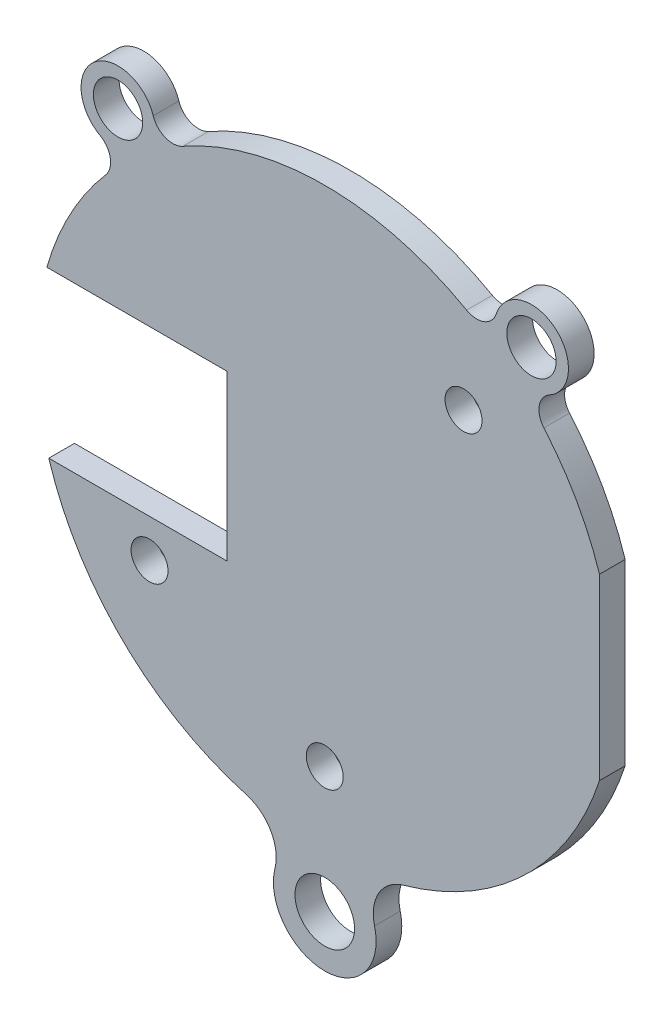
ISO-10303-21;
HEADER;
FILE_DESCRIPTION(('STEP AP214'),'2;1');
FILE_NAME('part.step','',(''),(''),'','','');
FILE_SCHEMA(('AUTOMOTIVE_DESIGN { 1 0 10303 214 1 1 1 1 }'));
ENDSEC;
DATA;
#1=APPLICATION_CONTEXT('core data for automotive mechanical design processes');
#2=APPLICATION_PROTOCOL_DEFINITION('international standard','automotive_design',2000,#1);
#3=PRODUCT_CONTEXT('',#1,'mechanical');
#4=PRODUCT('Part','Part','',(#3));
#5=PRODUCT_RELATED_PRODUCT_CATEGORY('part','',(#4));
#6=PRODUCT_DEFINITION_FORMATION('','',#4);
#7=PRODUCT_DEFINITION_CONTEXT('part definition',#1,'design');
#8=PRODUCT_DEFINITION('design','',#6,#7);
#9=PRODUCT_DEFINITION_SHAPE('','',#8);
#10=(LENGTH_UNIT() NAMED_UNIT(*) SI_UNIT(.MILLI.,.METRE.));
#11=(NAMED_UNIT(*) PLANE_ANGLE_UNIT() SI_UNIT($,.RADIAN.));
#12=(NAMED_UNIT(*) SI_UNIT($,.STERADIAN.) SOLID_ANGLE_UNIT());
#13=UNCERTAINTY_MEASURE_WITH_UNIT(LENGTH_MEASURE(1.E-05),#10,'distance_accuracy_value','');
#14=(GEOMETRIC_REPRESENTATION_CONTEXT(3) GLOBAL_UNCERTAINTY_ASSIGNED_CONTEXT((#13)) GLOBAL_UNIT_ASSIGNED_CONTEXT((#10,
#11,#12)) REPRESENTATION_CONTEXT('',''));
#15=CARTESIAN_POINT('',(0.,0.,0.));
#16=DIRECTION('',(0.,0.,1.));
#17=DIRECTION('',(1.,0.,0.));
#18=AXIS2_PLACEMENT_3D('',#15,#16,#17);
#19=CARTESIAN_POINT('',(0.,0.,1.5875));
#20=DIRECTION('',(0.,0.,1.));
#21=DIRECTION('',(1.,0.,0.));
#22=AXIS2_PLACEMENT_3D('',#19,#20,#21);
#23=PLANE('',#22);
#24=CARTESIAN_POINT('',(0.,-13.2588,1.5875));
#25=DIRECTION('',(0.,0.,1.));
#26=DIRECTION('',(1.,0.,0.));
#27=AXIS2_PLACEMENT_3D('',#24,#25,#26);
#28=CIRCLE('',#27,1.143);
#29=CARTESIAN_POINT('',(1.143,-13.2588,1.5875));
#30=VERTEX_POINT('',#29);
#31=EDGE_CURVE('E372',#30,#30,#28,.T.);
#32=ORIENTED_EDGE('',*,*,#31,.F.);
#33=EDGE_LOOP('',(#32));
#34=FACE_BOUND('',#33,.T.);
#35=CARTESIAN_POINT('',(-10.8325267726417,-7.64539999999999,1.5875));
#36=DIRECTION('',(0.,0.,1.));
#37=DIRECTION('',(1.,0.,0.));
#38=AXIS2_PLACEMENT_3D('',#35,#36,#37);
#39=CIRCLE('',#38,1.143);
#40=CARTESIAN_POINT('',(-9.68952677264175,-7.64539999999999,1.5875));
#41=VERTEX_POINT('',#40);
#42=EDGE_CURVE('E374',#41,#41,#39,.T.);
#43=ORIENTED_EDGE('',*,*,#42,.F.);
#44=EDGE_LOOP('',(#43));
#45=FACE_BOUND('',#44,.T.);
#46=CARTESIAN_POINT('',(8.57903565676236,10.1092,1.5875));
#47=DIRECTION('',(0.,0.,1.));
#48=DIRECTION('',(1.,0.,0.));
#49=AXIS2_PLACEMENT_3D('',#46,#47,#48);
#50=CIRCLE('',#49,1.143);
#51=CARTESIAN_POINT('',(9.72203565676236,10.1092,1.5875));
#52=VERTEX_POINT('',#51);
#53=EDGE_CURVE('E380',#52,#52,#50,.T.);
#54=ORIENTED_EDGE('',*,*,#53,.F.);
#55=EDGE_LOOP('',(#54));
#56=FACE_BOUND('',#55,.T.);
#57=CARTESIAN_POINT('',(12.7793395932632,15.5739650524873,1.5875));
#58=DIRECTION('',(0.,0.,1.));
#59=DIRECTION('',(1.,0.,0.));
#60=AXIS2_PLACEMENT_3D('',#57,#58,#59);
#61=CIRCLE('',#60,1.524);
#62=CARTESIAN_POINT('',(14.3033395932632,15.5739650524873,1.5875));
#63=VERTEX_POINT('',#62);
#64=EDGE_CURVE('E395',#63,#63,#61,.T.);
#65=ORIENTED_EDGE('',*,*,#64,.F.);
#66=EDGE_LOOP('',(#65));
#67=FACE_BOUND('',#66,.T.);
#68=DIRECTION('',(0.,-1.,0.));
#69=VECTOR('',#68,1.);
#70=CARTESIAN_POINT('',(-6.05626533764945,4.8768,1.5875));
#71=LINE('',#70,#69);
#72=CARTESIAN_POINT('',(-6.05626533764945,4.8768,1.5875));
#73=VERTEX_POINT('',#72);
#74=CARTESIAN_POINT('',(-6.05626533764945,-5.2832,1.5875));
#75=VERTEX_POINT('',#74);
#76=EDGE_CURVE('E225',#73,#75,#71,.T.);
#77=ORIENTED_EDGE('',*,*,#76,.T.);
#78=DIRECTION('',(-1.,0.,0.));
#79=VECTOR('',#78,1.);
#80=CARTESIAN_POINT('',(-17.060660873368,-5.2832,1.5875));
#81=LINE('',#80,#79);
#82=CARTESIAN_POINT('',(-17.060660873368,-5.28319999999999,1.5875));
#83=VERTEX_POINT('',#82);
#84=EDGE_CURVE('E123',#75,#83,#81,.T.);
#85=ORIENTED_EDGE('',*,*,#84,.T.);
#86=CARTESIAN_POINT('',(0.,0.,1.5875));
#87=DIRECTION('',(0.,0.,1.));
#88=DIRECTION('',(1.,0.,0.));
#89=AXIS2_PLACEMENT_3D('',#86,#87,#88);
#90=CIRCLE('',#89,17.8599650524873);
#91=CARTESIAN_POINT('',(-4.85058295667171,-17.1886647723584,1.5875));
#92=VERTEX_POINT('',#91);
#93=EDGE_CURVE('E270',#83,#92,#90,.T.);
#94=ORIENTED_EDGE('',*,*,#93,.T.);
#95=CARTESIAN_POINT('',(-5.54042085242001,-19.6331941089771,1.5875));
#96=DIRECTION('',(0.,0.,-1.));
#97=DIRECTION('',(1.,0.,0.));
#98=AXIS2_PLACEMENT_3D('',#95,#96,#97);
#99=CIRCLE('',#98,2.54);
#100=CARTESIAN_POINT('',(-3.07801158467779,-20.2562034172039,1.5875));
#101=VERTEX_POINT('',#100);
#102=EDGE_CURVE('E289',#92,#101,#99,.T.);
#103=ORIENTED_EDGE('',*,*,#102,.T.);
#104=CARTESIAN_POINT('',(0.,-21.0349650524873,1.5875));
#105=DIRECTION('',(0.,0.,1.));
#106=DIRECTION('',(1.,0.,0.));
#107=AXIS2_PLACEMENT_3D('',#104,#105,#106);
#108=CIRCLE('',#107,3.175);
#109=CARTESIAN_POINT('',(3.07801158467778,-20.2562034172039,1.5875));
#110=VERTEX_POINT('',#109);
#111=EDGE_CURVE('E286',#101,#110,#108,.T.);
#112=ORIENTED_EDGE('',*,*,#111,.T.);
#113=CARTESIAN_POINT('',(5.54042085242001,-19.6331941089771,1.5875));
#114=DIRECTION('',(0.,0.,-1.));
#115=DIRECTION('',(1.,0.,0.));
#116=AXIS2_PLACEMENT_3D('',#113,#114,#115);
#117=CIRCLE('',#116,2.54);
#118=CARTESIAN_POINT('',(4.85058295667169,-17.1886647723584,1.5875));
#119=VERTEX_POINT('',#118);
#120=EDGE_CURVE('E288',#110,#119,#117,.T.);
#121=ORIENTED_EDGE('',*,*,#120,.T.);
#122=CARTESIAN_POINT('',(0.,0.,1.5875));
#123=DIRECTION('',(0.,0.,1.));
#124=DIRECTION('',(1.,0.,0.));
#125=AXIS2_PLACEMENT_3D('',#122,#123,#124);
#126=CIRCLE('',#125,17.8599650524873);
#127=CARTESIAN_POINT('',(16.9840587441892,-5.5245,1.5875));
#128=VERTEX_POINT('',#127);
#129=EDGE_CURVE('E291',#119,#128,#126,.T.);
#130=ORIENTED_EDGE('',*,*,#129,.T.);
#131=DIRECTION('',(0.,1.,0.));
#132=VECTOR('',#131,1.);
#133=CARTESIAN_POINT('',(16.9840587441892,-5.5245,1.5875));
#134=LINE('',#133,#132);
#135=CARTESIAN_POINT('',(16.9840587441892,5.5245,1.5875));
#136=VERTEX_POINT('',#135);
#137=EDGE_CURVE('E297',#128,#136,#134,.T.);
#138=ORIENTED_EDGE('',*,*,#137,.T.);
#139=CARTESIAN_POINT('',(0.,0.,1.5875));
#140=DIRECTION('',(0.,0.,1.));
#141=DIRECTION('',(1.,0.,0.));
#142=AXIS2_PLACEMENT_3D('',#139,#140,#141);
#143=CIRCLE('',#142,17.8599650524873);
#144=CARTESIAN_POINT('',(13.5461924936276,11.639545549619,1.5875));
#145=VERTEX_POINT('',#144);
#146=EDGE_CURVE('E299',#136,#145,#143,.T.);
#147=ORIENTED_EDGE('',*,*,#146,.T.);
#148=CARTESIAN_POINT('',(14.509445468443,12.4672192211281,1.5875));
#149=DIRECTION('',(0.,0.,-1.));
#150=DIRECTION('',(1.,0.,0.));
#151=AXIS2_PLACEMENT_3D('',#148,#149,#150);
#152=CIRCLE('',#151,1.26999999999999);
#153=CARTESIAN_POINT('',(13.8915505130217,13.5767713037564,1.5875));
#154=VERTEX_POINT('',#153);
#155=EDGE_CURVE('E301',#145,#154,#152,.T.);
#156=ORIENTED_EDGE('',*,*,#155,.T.);
#157=CARTESIAN_POINT('',(12.7793395932632,15.5739650524873,1.5875));
#158=DIRECTION('',(0.,0.,1.));
#159=DIRECTION('',(1.,0.,0.));
#160=AXIS2_PLACEMENT_3D('',#157,#158,#159);
#161=CIRCLE('',#160,2.28599999999999);
#162=CARTESIAN_POINT('',(10.6034384604149,16.2748575264587,1.5875));
#163=VERTEX_POINT('',#162);
#164=EDGE_CURVE('E303',#154,#163,#161,.T.);
#165=ORIENTED_EDGE('',*,*,#164,.T.);
#166=CARTESIAN_POINT('',(9.39460449772144,16.6642422342205,1.5875));
#167=DIRECTION('',(0.,0.,-1.));
#168=DIRECTION('',(1.,0.,0.));
#169=AXIS2_PLACEMENT_3D('',#166,#167,#168);
#170=CIRCLE('',#169,1.27000000000001);
#171=CARTESIAN_POINT('',(8.77091555321106,15.5579366252247,1.5875));
#172=VERTEX_POINT('',#171);
#173=EDGE_CURVE('E305',#163,#172,#170,.T.);
#174=ORIENTED_EDGE('',*,*,#173,.T.);
#175=CARTESIAN_POINT('',(0.,0.,1.5875));
#176=DIRECTION('',(0.,0.,1.));
#177=DIRECTION('',(1.,0.,0.));
#178=AXIS2_PLACEMENT_3D('',#175,#176,#177);
#179=CIRCLE('',#178,17.8599650524873);
#180=CARTESIAN_POINT('',(-8.77091555321106,15.5579366252247,1.5875));
#181=VERTEX_POINT('',#180);
#182=EDGE_CURVE('E307',#172,#181,#179,.T.);
#183=ORIENTED_EDGE('',*,*,#182,.T.);
#184=CARTESIAN_POINT('',(-9.39460449772144,16.6642422342205,1.5875));
#185=DIRECTION('',(0.,0.,-1.));
#186=DIRECTION('',(1.,0.,0.));
#187=AXIS2_PLACEMENT_3D('',#184,#185,#186);
#188=CIRCLE('',#187,1.27000000000001);
#189=CARTESIAN_POINT('',(-10.6034384604149,16.2748575264587,1.5875));
#190=VERTEX_POINT('',#189);
#191=EDGE_CURVE('E309',#181,#190,#188,.T.);
#192=ORIENTED_EDGE('',*,*,#191,.T.);
#193=CARTESIAN_POINT('',(-12.7793395932632,15.5739650524873,1.5875));
#194=DIRECTION('',(0.,0.,1.));
#195=DIRECTION('',(1.,0.,0.));
#196=AXIS2_PLACEMENT_3D('',#193,#194,#195);
#197=CIRCLE('',#196,2.28599999999999);
#198=CARTESIAN_POINT('',(-13.8915505130216,13.5767713037564,1.5875));
#199=VERTEX_POINT('',#198);
#200=EDGE_CURVE('E172',#190,#199,#197,.T.);
#201=ORIENTED_EDGE('',*,*,#200,.T.);
#202=CARTESIAN_POINT('',(-14.509445468443,12.4672192211281,1.5875));
#203=DIRECTION('',(0.,0.,-1.));
#204=DIRECTION('',(1.,0.,0.));
#205=AXIS2_PLACEMENT_3D('',#202,#203,#204);
#206=CIRCLE('',#205,1.26999999999999);
#207=CARTESIAN_POINT('',(-13.5461924936276,11.639545549619,1.5875));
#208=VERTEX_POINT('',#207);
#209=EDGE_CURVE('E166',#199,#208,#206,.T.);
#210=ORIENTED_EDGE('',*,*,#209,.T.);
#211=CARTESIAN_POINT('',(0.,0.,1.5875));
#212=DIRECTION('',(0.,0.,1.));
#213=DIRECTION('',(1.,0.,0.));
#214=AXIS2_PLACEMENT_3D('',#211,#212,#213);
#215=CIRCLE('',#214,17.8599650524873);
#216=CARTESIAN_POINT('',(-17.1812448162544,4.8768,1.5875));
#217=VERTEX_POINT('',#216);
#218=EDGE_CURVE('E170',#208,#217,#215,.T.);
#219=ORIENTED_EDGE('',*,*,#218,.T.);
#220=DIRECTION('',(1.,0.,0.));
#221=VECTOR('',#220,1.);
#222=CARTESIAN_POINT('',(-6.05626533764945,4.8768,1.5875));
#223=LINE('',#222,#221);
#224=EDGE_CURVE('E50',#217,#73,#223,.T.);
#225=ORIENTED_EDGE('',*,*,#224,.T.);
#226=EDGE_LOOP('',(#77,#85,#94,#103,#112,#121,#130,#138,#147,#156,#165,#174,#183,#192,#201,#210,
#219,#225));
#227=FACE_BOUND('',#226,.T.);
#228=CARTESIAN_POINT('',(0.,-21.0349650524873,1.5875));
#229=DIRECTION('',(0.,0.,1.));
#230=DIRECTION('',(1.,0.,0.));
#231=AXIS2_PLACEMENT_3D('',#228,#229,#230);
#232=CIRCLE('',#231,1.8415);
#233=CARTESIAN_POINT('',(1.8415,-21.0349650524873,1.5875));
#234=VERTEX_POINT('',#233);
#235=EDGE_CURVE('E194',#234,#234,#232,.T.);
#236=ORIENTED_EDGE('',*,*,#235,.F.);
#237=EDGE_LOOP('',(#236));
#238=FACE_BOUND('',#237,.T.);
#239=CARTESIAN_POINT('',(-12.7793395932632,15.5739650524873,1.5875));
#240=DIRECTION('',(0.,0.,1.));
#241=DIRECTION('',(1.,0.,0.));
#242=AXIS2_PLACEMENT_3D('',#239,#240,#241);
#243=CIRCLE('',#242,1.524);
#244=CARTESIAN_POINT('',(-11.2553395932632,15.5739650524873,1.5875));
#245=VERTEX_POINT('',#244);
#246=EDGE_CURVE('E389',#245,#245,#243,.T.);
#247=ORIENTED_EDGE('',*,*,#246,.F.);
#248=EDGE_LOOP('',(#247));
#249=FACE_BOUND('',#248,.T.);
#250=ADVANCED_FACE('F33',(#34,#45,#56,#67,#227,#238,#249),#23,.T.);
#251=CARTESIAN_POINT('',(0.,0.,0.));
#252=DIRECTION('',(0.,0.,1.));
#253=DIRECTION('',(1.,0.,0.));
#254=AXIS2_PLACEMENT_3D('',#251,#252,#253);
#255=PLANE('',#254);
#256=CARTESIAN_POINT('',(0.,-13.2588,0.));
#257=DIRECTION('',(0.,0.,1.));
#258=DIRECTION('',(1.,0.,0.));
#259=AXIS2_PLACEMENT_3D('',#256,#257,#258);
#260=CIRCLE('',#259,1.143);
#261=CARTESIAN_POINT('',(1.143,-13.2588,0.));
#262=VERTEX_POINT('',#261);
#263=EDGE_CURVE('E370',#262,#262,#260,.T.);
#264=ORIENTED_EDGE('',*,*,#263,.T.);
#265=EDGE_LOOP('',(#264));
#266=FACE_BOUND('',#265,.T.);
#267=CARTESIAN_POINT('',(-10.8325267726417,-7.64539999999999,0.));
#268=DIRECTION('',(0.,0.,1.));
#269=DIRECTION('',(1.,0.,0.));
#270=AXIS2_PLACEMENT_3D('',#267,#268,#269);
#271=CIRCLE('',#270,1.143);
#272=CARTESIAN_POINT('',(-9.68952677264175,-7.64539999999999,0.));
#273=VERTEX_POINT('',#272);
#274=EDGE_CURVE('E377',#273,#273,#271,.T.);
#275=ORIENTED_EDGE('',*,*,#274,.T.);
#276=EDGE_LOOP('',(#275));
#277=FACE_BOUND('',#276,.T.);
#278=CARTESIAN_POINT('',(8.57903565676236,10.1092,0.));
#279=DIRECTION('',(0.,0.,1.));
#280=DIRECTION('',(1.,0.,0.));
#281=AXIS2_PLACEMENT_3D('',#278,#279,#280);
#282=CIRCLE('',#281,1.143);
#283=CARTESIAN_POINT('',(9.72203565676236,10.1092,0.));
#284=VERTEX_POINT('',#283);
#285=EDGE_CURVE('E383',#284,#284,#282,.T.);
#286=ORIENTED_EDGE('',*,*,#285,.T.);
#287=EDGE_LOOP('',(#286));
#288=FACE_BOUND('',#287,.T.);
#289=CARTESIAN_POINT('',(12.7793395932632,15.5739650524873,0.));
#290=DIRECTION('',(0.,0.,1.));
#291=DIRECTION('',(1.,0.,0.));
#292=AXIS2_PLACEMENT_3D('',#289,#290,#291);
#293=CIRCLE('',#292,1.524);
#294=CARTESIAN_POINT('',(14.3033395932632,15.5739650524873,0.));
#295=VERTEX_POINT('',#294);
#296=EDGE_CURVE('E392',#295,#295,#293,.T.);
#297=ORIENTED_EDGE('',*,*,#296,.T.);
#298=EDGE_LOOP('',(#297));
#299=FACE_BOUND('',#298,.T.);
#300=DIRECTION('',(0.,-1.,0.));
#301=VECTOR('',#300,1.);
#302=CARTESIAN_POINT('',(-6.05626533764945,4.8768,0.));
#303=LINE('',#302,#301);
#304=CARTESIAN_POINT('',(-6.05626533764945,4.8768,0.));
#305=VERTEX_POINT('',#304);
#306=CARTESIAN_POINT('',(-6.05626533764945,-5.2832,0.));
#307=VERTEX_POINT('',#306);
#308=EDGE_CURVE('E190',#305,#307,#303,.T.);
#309=ORIENTED_EDGE('',*,*,#308,.F.);
#310=DIRECTION('',(1.,0.,0.));
#311=VECTOR('',#310,1.);
#312=CARTESIAN_POINT('',(-6.05626533764945,4.8768,0.));
#313=LINE('',#312,#311);
#314=CARTESIAN_POINT('',(-17.1812448162544,4.8768,0.));
#315=VERTEX_POINT('',#314);
#316=EDGE_CURVE('E115',#315,#305,#313,.T.);
#317=ORIENTED_EDGE('',*,*,#316,.F.);
#318=CARTESIAN_POINT('',(0.,0.,0.));
#319=DIRECTION('',(0.,0.,1.));
#320=DIRECTION('',(1.,0.,0.));
#321=AXIS2_PLACEMENT_3D('',#318,#319,#320);
#322=CIRCLE('',#321,17.8599650524873);
#323=CARTESIAN_POINT('',(-13.5461924936276,11.639545549619,0.));
#324=VERTEX_POINT('',#323);
#325=EDGE_CURVE('E109',#324,#315,#322,.T.);
#326=ORIENTED_EDGE('',*,*,#325,.F.);
#327=CARTESIAN_POINT('',(-14.509445468443,12.4672192211281,0.));
#328=DIRECTION('',(0.,0.,-1.));
#329=DIRECTION('',(1.,0.,0.));
#330=AXIS2_PLACEMENT_3D('',#327,#328,#329);
#331=CIRCLE('',#330,1.26999999999999);
#332=CARTESIAN_POINT('',(-13.8915505130216,13.5767713037564,0.));
#333=VERTEX_POINT('',#332);
#334=EDGE_CURVE('E180',#333,#324,#331,.T.);
#335=ORIENTED_EDGE('',*,*,#334,.F.);
#336=CARTESIAN_POINT('',(-12.7793395932632,15.5739650524873,0.));
#337=DIRECTION('',(0.,0.,1.));
#338=DIRECTION('',(1.,0.,0.));
#339=AXIS2_PLACEMENT_3D('',#336,#337,#338);
#340=CIRCLE('',#339,2.28599999999999);
#341=CARTESIAN_POINT('',(-10.6034384604149,16.2748575264587,0.));
#342=VERTEX_POINT('',#341);
#343=EDGE_CURVE('E220',#342,#333,#340,.T.);
#344=ORIENTED_EDGE('',*,*,#343,.F.);
#345=CARTESIAN_POINT('',(-9.39460449772144,16.6642422342205,0.));
#346=DIRECTION('',(0.,0.,-1.));
#347=DIRECTION('',(1.,0.,0.));
#348=AXIS2_PLACEMENT_3D('',#345,#346,#347);
#349=CIRCLE('',#348,1.27000000000001);
#350=CARTESIAN_POINT('',(-8.77091555321106,15.5579366252247,0.));
#351=VERTEX_POINT('',#350);
#352=EDGE_CURVE('E218',#351,#342,#349,.T.);
#353=ORIENTED_EDGE('',*,*,#352,.F.);
#354=CARTESIAN_POINT('',(0.,0.,0.));
#355=DIRECTION('',(0.,0.,1.));
#356=DIRECTION('',(1.,0.,0.));
#357=AXIS2_PLACEMENT_3D('',#354,#355,#356);
#358=CIRCLE('',#357,17.8599650524873);
#359=CARTESIAN_POINT('',(8.77091555321106,15.5579366252247,0.));
#360=VERTEX_POINT('',#359);
#361=EDGE_CURVE('E216',#360,#351,#358,.T.);
#362=ORIENTED_EDGE('',*,*,#361,.F.);
#363=CARTESIAN_POINT('',(9.39460449772144,16.6642422342205,0.));
#364=DIRECTION('',(0.,0.,-1.));
#365=DIRECTION('',(1.,0.,0.));
#366=AXIS2_PLACEMENT_3D('',#363,#364,#365);
#367=CIRCLE('',#366,1.27000000000001);
#368=CARTESIAN_POINT('',(10.6034384604149,16.2748575264587,0.));
#369=VERTEX_POINT('',#368);
#370=EDGE_CURVE('E214',#369,#360,#367,.T.);
#371=ORIENTED_EDGE('',*,*,#370,.F.);
#372=CARTESIAN_POINT('',(12.7793395932632,15.5739650524873,0.));
#373=DIRECTION('',(0.,0.,1.));
#374=DIRECTION('',(1.,0.,0.));
#375=AXIS2_PLACEMENT_3D('',#372,#373,#374);
#376=CIRCLE('',#375,2.28599999999999);
#377=CARTESIAN_POINT('',(13.8915505130217,13.5767713037564,0.));
#378=VERTEX_POINT('',#377);
#379=EDGE_CURVE('E212',#378,#369,#376,.T.);
#380=ORIENTED_EDGE('',*,*,#379,.F.);
#381=CARTESIAN_POINT('',(14.509445468443,12.4672192211281,0.));
#382=DIRECTION('',(0.,0.,-1.));
#383=DIRECTION('',(1.,0.,0.));
#384=AXIS2_PLACEMENT_3D('',#381,#382,#383);
#385=CIRCLE('',#384,1.26999999999999);
#386=CARTESIAN_POINT('',(13.5461924936276,11.639545549619,0.));
#387=VERTEX_POINT('',#386);
#388=EDGE_CURVE('E210',#387,#378,#385,.T.);
#389=ORIENTED_EDGE('',*,*,#388,.F.);
#390=CARTESIAN_POINT('',(0.,0.,0.));
#391=DIRECTION('',(0.,0.,1.));
#392=DIRECTION('',(1.,0.,0.));
#393=AXIS2_PLACEMENT_3D('',#390,#391,#392);
#394=CIRCLE('',#393,17.8599650524873);
#395=CARTESIAN_POINT('',(16.9840587441892,5.5245,0.));
#396=VERTEX_POINT('',#395);
#397=EDGE_CURVE('E208',#396,#387,#394,.T.);
#398=ORIENTED_EDGE('',*,*,#397,.F.);
#399=DIRECTION('',(0.,1.,0.));
#400=VECTOR('',#399,1.);
#401=CARTESIAN_POINT('',(16.9840587441892,-5.5245,0.));
#402=LINE('',#401,#400);
#403=CARTESIAN_POINT('',(16.9840587441892,-5.5245,0.));
#404=VERTEX_POINT('',#403);
#405=EDGE_CURVE('E206',#404,#396,#402,.T.);
#406=ORIENTED_EDGE('',*,*,#405,.F.);
#407=CARTESIAN_POINT('',(0.,0.,0.));
#408=DIRECTION('',(0.,0.,1.));
#409=DIRECTION('',(1.,0.,0.));
#410=AXIS2_PLACEMENT_3D('',#407,#408,#409);
#411=CIRCLE('',#410,17.8599650524873);
#412=CARTESIAN_POINT('',(4.85058295667169,-17.1886647723584,0.));
#413=VERTEX_POINT('',#412);
#414=EDGE_CURVE('E204',#413,#404,#411,.T.);
#415=ORIENTED_EDGE('',*,*,#414,.F.);
#416=CARTESIAN_POINT('',(5.54042085242001,-19.6331941089771,0.));
#417=DIRECTION('',(0.,0.,-1.));
#418=DIRECTION('',(1.,0.,0.));
#419=AXIS2_PLACEMENT_3D('',#416,#417,#418);
#420=CIRCLE('',#419,2.54);
#421=CARTESIAN_POINT('',(3.07801158467778,-20.2562034172039,0.));
#422=VERTEX_POINT('',#421);
#423=EDGE_CURVE('E202',#422,#413,#420,.T.);
#424=ORIENTED_EDGE('',*,*,#423,.F.);
#425=CARTESIAN_POINT('',(0.,-21.0349650524873,0.));
#426=DIRECTION('',(0.,0.,1.));
#427=DIRECTION('',(1.,0.,0.));
#428=AXIS2_PLACEMENT_3D('',#425,#426,#427);
#429=CIRCLE('',#428,3.175);
#430=CARTESIAN_POINT('',(-3.07801158467779,-20.2562034172039,0.));
#431=VERTEX_POINT('',#430);
#432=EDGE_CURVE('E200',#431,#422,#429,.T.);
#433=ORIENTED_EDGE('',*,*,#432,.F.);
#434=CARTESIAN_POINT('',(-5.54042085242001,-19.6331941089771,0.));
#435=DIRECTION('',(0.,0.,-1.));
#436=DIRECTION('',(1.,0.,0.));
#437=AXIS2_PLACEMENT_3D('',#434,#435,#436);
#438=CIRCLE('',#437,2.54);
#439=CARTESIAN_POINT('',(-4.85058295667171,-17.1886647723584,0.));
#440=VERTEX_POINT('',#439);
#441=EDGE_CURVE('E198',#440,#431,#438,.T.);
#442=ORIENTED_EDGE('',*,*,#441,.F.);
#443=CARTESIAN_POINT('',(0.,0.,0.));
#444=DIRECTION('',(0.,0.,1.));
#445=DIRECTION('',(1.,0.,0.));
#446=AXIS2_PLACEMENT_3D('',#443,#444,#445);
#447=CIRCLE('',#446,17.8599650524873);
#448=CARTESIAN_POINT('',(-17.060660873368,-5.28319999999999,0.));
#449=VERTEX_POINT('',#448);
#450=EDGE_CURVE('E196',#449,#440,#447,.T.);
#451=ORIENTED_EDGE('',*,*,#450,.F.);
#452=DIRECTION('',(-1.,0.,0.));
#453=VECTOR('',#452,1.);
#454=CARTESIAN_POINT('',(-17.060660873368,-5.2832,0.));
#455=LINE('',#454,#453);
#456=EDGE_CURVE('E193',#307,#449,#455,.T.);
#457=ORIENTED_EDGE('',*,*,#456,.F.);
#458=EDGE_LOOP('',(#309,#317,#326,#335,#344,#353,#362,#371,#380,#389,#398,#406,#415,#424,#433,
#442,#451,#457));
#459=FACE_BOUND('',#458,.T.);
#460=CARTESIAN_POINT('',(0.,-21.0349650524873,0.));
#461=DIRECTION('',(0.,0.,1.));
#462=DIRECTION('',(1.,0.,0.));
#463=AXIS2_PLACEMENT_3D('',#460,#461,#462);
#464=CIRCLE('',#463,1.8415);
#465=CARTESIAN_POINT('',(1.8415,-21.0349650524873,0.));
#466=VERTEX_POINT('',#465);
#467=EDGE_CURVE('E398',#466,#466,#464,.T.);
#468=ORIENTED_EDGE('',*,*,#467,.T.);
#469=EDGE_LOOP('',(#468));
#470=FACE_BOUND('',#469,.T.);
#471=CARTESIAN_POINT('',(-12.7793395932632,15.5739650524873,0.));
#472=DIRECTION('',(0.,0.,1.));
#473=DIRECTION('',(1.,0.,0.));
#474=AXIS2_PLACEMENT_3D('',#471,#472,#473);
#475=CIRCLE('',#474,1.524);
#476=CARTESIAN_POINT('',(-11.2553395932632,15.5739650524873,0.));
#477=VERTEX_POINT('',#476);
#478=EDGE_CURVE('E386',#477,#477,#475,.T.);
#479=ORIENTED_EDGE('',*,*,#478,.T.);
#480=EDGE_LOOP('',(#479));
#481=FACE_BOUND('',#480,.T.);
#482=ADVANCED_FACE('F274',(#266,#277,#288,#299,#459,#470,#481),#255,.F.);
#483=CARTESIAN_POINT('',(-6.05626533764945,4.8768,1.5875));
#484=DIRECTION('',(1.,0.,0.));
#485=DIRECTION('',(0.,1.,0.));
#486=AXIS2_PLACEMENT_3D('',#483,#484,#485);
#487=PLANE('',#486);
#488=ORIENTED_EDGE('',*,*,#308,.T.);
#489=DIRECTION('',(0.,0.,-1.));
#490=VECTOR('',#489,1.);
#491=CARTESIAN_POINT('',(-6.05626533764945,-5.2832,1.5875));
#492=LINE('',#491,#490);
#493=EDGE_CURVE('E11',#75,#307,#492,.T.);
#494=ORIENTED_EDGE('',*,*,#493,.F.);
#495=ORIENTED_EDGE('',*,*,#76,.F.);
#496=DIRECTION('',(0.,0.,-1.));
#497=VECTOR('',#496,1.);
#498=CARTESIAN_POINT('',(-6.05626533764945,4.8768,1.5875));
#499=LINE('',#498,#497);
#500=EDGE_CURVE('E186',#73,#305,#499,.T.);
#501=ORIENTED_EDGE('',*,*,#500,.T.);
#502=EDGE_LOOP('',(#488,#494,#495,#501));
#503=FACE_BOUND('',#502,.T.);
#504=ADVANCED_FACE('F35',(#503),#487,.F.);
#505=CARTESIAN_POINT('',(-17.060660873368,-5.2832,1.5875));
#506=DIRECTION('',(0.,-1.,0.));
#507=DIRECTION('',(1.,0.,0.));
#508=AXIS2_PLACEMENT_3D('',#505,#506,#507);
#509=PLANE('',#508);
#510=ORIENTED_EDGE('',*,*,#456,.T.);
#511=DIRECTION('',(0.,0.,-1.));
#512=VECTOR('',#511,1.);
#513=CARTESIAN_POINT('',(-17.060660873368,-5.28319999999999,1.5875));
#514=LINE('',#513,#512);
#515=EDGE_CURVE('E42',#83,#449,#514,.T.);
#516=ORIENTED_EDGE('',*,*,#515,.F.);
#517=ORIENTED_EDGE('',*,*,#84,.F.);
#518=ORIENTED_EDGE('',*,*,#493,.T.);
#519=EDGE_LOOP('',(#510,#516,#517,#518));
#520=FACE_BOUND('',#519,.T.);
#521=ADVANCED_FACE('F586',(#520),#509,.F.);
#522=CARTESIAN_POINT('',(0.,0.,1.5875));
#523=DIRECTION('',(0.,0.,-1.));
#524=DIRECTION('',(-1.,0.,0.));
#525=AXIS2_PLACEMENT_3D('',#522,#523,#524);
#526=CYLINDRICAL_SURFACE('',#525,17.8599650524873);
#527=ORIENTED_EDGE('',*,*,#450,.T.);
#528=DIRECTION('',(0.,0.,-1.));
#529=VECTOR('',#528,1.);
#530=CARTESIAN_POINT('',(-4.85058295667171,-17.1886647723584,1.5875));
#531=LINE('',#530,#529);
#532=EDGE_CURVE('E262',#92,#440,#531,.T.);
#533=ORIENTED_EDGE('',*,*,#532,.F.);
#534=ORIENTED_EDGE('',*,*,#93,.F.);
#535=ORIENTED_EDGE('',*,*,#515,.T.);
#536=EDGE_LOOP('',(#527,#533,#534,#535));
#537=FACE_BOUND('',#536,.T.);
#538=ADVANCED_FACE('F268',(#537),#526,.T.);
#539=CARTESIAN_POINT('',(-5.54042085242001,-19.6331941089771,1.5875));
#540=DIRECTION('',(0.,0.,-1.));
#541=DIRECTION('',(-1.,0.,0.));
#542=AXIS2_PLACEMENT_3D('',#539,#540,#541);
#543=CYLINDRICAL_SURFACE('',#542,2.54);
#544=ORIENTED_EDGE('',*,*,#441,.T.);
#545=DIRECTION('',(0.,0.,-1.));
#546=VECTOR('',#545,1.);
#547=CARTESIAN_POINT('',(-3.07801158467779,-20.2562034172039,1.5875));
#548=LINE('',#547,#546);
#549=EDGE_CURVE('E259',#101,#431,#548,.T.);
#550=ORIENTED_EDGE('',*,*,#549,.F.);
#551=ORIENTED_EDGE('',*,*,#102,.F.);
#552=ORIENTED_EDGE('',*,*,#532,.T.);
#553=EDGE_LOOP('',(#544,#550,#551,#552));
#554=FACE_BOUND('',#553,.T.);
#555=ADVANCED_FACE('F280',(#554),#543,.F.);
#556=CARTESIAN_POINT('',(0.,-21.0349650524873,1.5875));
#557=DIRECTION('',(0.,0.,-1.));
#558=DIRECTION('',(-1.,0.,0.));
#559=AXIS2_PLACEMENT_3D('',#556,#557,#558);
#560=CYLINDRICAL_SURFACE('',#559,3.175);
#561=ORIENTED_EDGE('',*,*,#432,.T.);
#562=DIRECTION('',(0.,0.,-1.));
#563=VECTOR('',#562,1.);
#564=CARTESIAN_POINT('',(3.07801158467778,-20.2562034172039,1.5875));
#565=LINE('',#564,#563);
#566=EDGE_CURVE('E256',#110,#422,#565,.T.);
#567=ORIENTED_EDGE('',*,*,#566,.F.);
#568=ORIENTED_EDGE('',*,*,#111,.F.);
#569=ORIENTED_EDGE('',*,*,#549,.T.);
#570=EDGE_LOOP('',(#561,#567,#568,#569));
#571=FACE_BOUND('',#570,.T.);
#572=ADVANCED_FACE('F284',(#571),#560,.T.);
#573=CARTESIAN_POINT('',(5.54042085242001,-19.6331941089771,1.5875));
#574=DIRECTION('',(0.,0.,-1.));
#575=DIRECTION('',(-1.,0.,0.));
#576=AXIS2_PLACEMENT_3D('',#573,#574,#575);
#577=CYLINDRICAL_SURFACE('',#576,2.54);
#578=ORIENTED_EDGE('',*,*,#423,.T.);
#579=DIRECTION('',(0.,0.,-1.));
#580=VECTOR('',#579,1.);
#581=CARTESIAN_POINT('',(4.85058295667169,-17.1886647723584,1.5875));
#582=LINE('',#581,#580);
#583=EDGE_CURVE('E253',#119,#413,#582,.T.);
#584=ORIENTED_EDGE('',*,*,#583,.F.);
#585=ORIENTED_EDGE('',*,*,#120,.F.);
#586=ORIENTED_EDGE('',*,*,#566,.T.);
#587=EDGE_LOOP('',(#578,#584,#585,#586));
#588=FACE_BOUND('',#587,.T.);
#589=ADVANCED_FACE('F551',(#588),#577,.F.);
#590=CARTESIAN_POINT('',(0.,0.,1.5875));
#591=DIRECTION('',(0.,0.,-1.));
#592=DIRECTION('',(-1.,0.,0.));
#593=AXIS2_PLACEMENT_3D('',#590,#591,#592);
#594=CYLINDRICAL_SURFACE('',#593,17.8599650524873);
#595=ORIENTED_EDGE('',*,*,#414,.T.);
#596=DIRECTION('',(0.,0.,-1.));
#597=VECTOR('',#596,1.);
#598=CARTESIAN_POINT('',(16.9840587441892,-5.5245,1.5875));
#599=LINE('',#598,#597);
#600=EDGE_CURVE('E250',#128,#404,#599,.T.);
#601=ORIENTED_EDGE('',*,*,#600,.F.);
#602=ORIENTED_EDGE('',*,*,#129,.F.);
#603=ORIENTED_EDGE('',*,*,#583,.T.);
#604=EDGE_LOOP('',(#595,#601,#602,#603));
#605=FACE_BOUND('',#604,.T.);
#606=ADVANCED_FACE('F541',(#605),#594,.T.);
#607=CARTESIAN_POINT('',(16.9840587441892,-5.5245,1.5875));
#608=DIRECTION('',(-1.,0.,0.));
#609=DIRECTION('',(0.,-1.,0.));
#610=AXIS2_PLACEMENT_3D('',#607,#608,#609);
#611=PLANE('',#610);
#612=ORIENTED_EDGE('',*,*,#405,.T.);
#613=DIRECTION('',(0.,0.,-1.));
#614=VECTOR('',#613,1.);
#615=CARTESIAN_POINT('',(16.9840587441892,5.5245,1.5875));
#616=LINE('',#615,#614);
#617=EDGE_CURVE('E247',#136,#396,#616,.T.);
#618=ORIENTED_EDGE('',*,*,#617,.F.);
#619=ORIENTED_EDGE('',*,*,#137,.F.);
#620=ORIENTED_EDGE('',*,*,#600,.T.);
#621=EDGE_LOOP('',(#612,#618,#619,#620));
#622=FACE_BOUND('',#621,.T.);
#623=ADVANCED_FACE('F531',(#622),#611,.F.);
#624=CARTESIAN_POINT('',(0.,0.,1.5875));
#625=DIRECTION('',(0.,0.,-1.));
#626=DIRECTION('',(-1.,0.,0.));
#627=AXIS2_PLACEMENT_3D('',#624,#625,#626);
#628=CYLINDRICAL_SURFACE('',#627,17.8599650524873);
#629=ORIENTED_EDGE('',*,*,#397,.T.);
#630=DIRECTION('',(0.,0.,-1.));
#631=VECTOR('',#630,1.);
#632=CARTESIAN_POINT('',(13.5461924936276,11.639545549619,1.5875));
#633=LINE('',#632,#631);
#634=EDGE_CURVE('E244',#145,#387,#633,.T.);
#635=ORIENTED_EDGE('',*,*,#634,.F.);
#636=ORIENTED_EDGE('',*,*,#146,.F.);
#637=ORIENTED_EDGE('',*,*,#617,.T.);
#638=EDGE_LOOP('',(#629,#635,#636,#637));
#639=FACE_BOUND('',#638,.T.);
#640=ADVANCED_FACE('F521',(#639),#628,.T.);
#641=CARTESIAN_POINT('',(14.509445468443,12.4672192211281,1.5875));
#642=DIRECTION('',(0.,0.,-1.));
#643=DIRECTION('',(-1.,0.,0.));
#644=AXIS2_PLACEMENT_3D('',#641,#642,#643);
#645=CYLINDRICAL_SURFACE('',#644,1.26999999999999);
#646=ORIENTED_EDGE('',*,*,#388,.T.);
#647=DIRECTION('',(0.,0.,-1.));
#648=VECTOR('',#647,1.);
#649=CARTESIAN_POINT('',(13.8915505130217,13.5767713037564,1.5875));
#650=LINE('',#649,#648);
#651=EDGE_CURVE('E241',#154,#378,#650,.T.);
#652=ORIENTED_EDGE('',*,*,#651,.F.);
#653=ORIENTED_EDGE('',*,*,#155,.F.);
#654=ORIENTED_EDGE('',*,*,#634,.T.);
#655=EDGE_LOOP('',(#646,#652,#653,#654));
#656=FACE_BOUND('',#655,.T.);
#657=ADVANCED_FACE('F511',(#656),#645,.F.);
#658=CARTESIAN_POINT('',(12.7793395932632,15.5739650524873,1.5875));
#659=DIRECTION('',(0.,0.,-1.));
#660=DIRECTION('',(-1.,0.,0.));
#661=AXIS2_PLACEMENT_3D('',#658,#659,#660);
#662=CYLINDRICAL_SURFACE('',#661,2.28599999999999);
#663=ORIENTED_EDGE('',*,*,#379,.T.);
#664=DIRECTION('',(0.,0.,-1.));
#665=VECTOR('',#664,1.);
#666=CARTESIAN_POINT('',(10.6034384604149,16.2748575264587,1.5875));
#667=LINE('',#666,#665);
#668=EDGE_CURVE('E238',#163,#369,#667,.T.);
#669=ORIENTED_EDGE('',*,*,#668,.F.);
#670=ORIENTED_EDGE('',*,*,#164,.F.);
#671=ORIENTED_EDGE('',*,*,#651,.T.);
#672=EDGE_LOOP('',(#663,#669,#670,#671));
#673=FACE_BOUND('',#672,.T.);
#674=ADVANCED_FACE('F501',(#673),#662,.T.);
#675=CARTESIAN_POINT('',(9.39460449772144,16.6642422342205,1.5875));
#676=DIRECTION('',(0.,0.,-1.));
#677=DIRECTION('',(-1.,0.,0.));
#678=AXIS2_PLACEMENT_3D('',#675,#676,#677);
#679=CYLINDRICAL_SURFACE('',#678,1.27000000000001);
#680=ORIENTED_EDGE('',*,*,#370,.T.);
#681=DIRECTION('',(0.,0.,-1.));
#682=VECTOR('',#681,1.);
#683=CARTESIAN_POINT('',(8.77091555321106,15.5579366252247,1.5875));
#684=LINE('',#683,#682);
#685=EDGE_CURVE('E235',#172,#360,#684,.T.);
#686=ORIENTED_EDGE('',*,*,#685,.F.);
#687=ORIENTED_EDGE('',*,*,#173,.F.);
#688=ORIENTED_EDGE('',*,*,#668,.T.);
#689=EDGE_LOOP('',(#680,#686,#687,#688));
#690=FACE_BOUND('',#689,.T.);
#691=ADVANCED_FACE('F491',(#690),#679,.F.);
#692=CARTESIAN_POINT('',(0.,0.,1.5875));
#693=DIRECTION('',(0.,0.,-1.));
#694=DIRECTION('',(-1.,0.,0.));
#695=AXIS2_PLACEMENT_3D('',#692,#693,#694);
#696=CYLINDRICAL_SURFACE('',#695,17.8599650524873);
#697=ORIENTED_EDGE('',*,*,#361,.T.);
#698=DIRECTION('',(0.,0.,-1.));
#699=VECTOR('',#698,1.);
#700=CARTESIAN_POINT('',(-8.77091555321106,15.5579366252247,1.5875));
#701=LINE('',#700,#699);
#702=EDGE_CURVE('E232',#181,#351,#701,.T.);
#703=ORIENTED_EDGE('',*,*,#702,.F.);
#704=ORIENTED_EDGE('',*,*,#182,.F.);
#705=ORIENTED_EDGE('',*,*,#685,.T.);
#706=EDGE_LOOP('',(#697,#703,#704,#705));
#707=FACE_BOUND('',#706,.T.);
#708=ADVANCED_FACE('F482',(#707),#696,.T.);
#709=CARTESIAN_POINT('',(-9.39460449772144,16.6642422342205,1.5875));
#710=DIRECTION('',(0.,0.,-1.));
#711=DIRECTION('',(-1.,0.,0.));
#712=AXIS2_PLACEMENT_3D('',#709,#710,#711);
#713=CYLINDRICAL_SURFACE('',#712,1.27000000000001);
#714=ORIENTED_EDGE('',*,*,#352,.T.);
#715=DIRECTION('',(0.,0.,-1.));
#716=VECTOR('',#715,1.);
#717=CARTESIAN_POINT('',(-10.6034384604149,16.2748575264587,1.5875));
#718=LINE('',#717,#716);
#719=EDGE_CURVE('E229',#190,#342,#718,.T.);
#720=ORIENTED_EDGE('',*,*,#719,.F.);
#721=ORIENTED_EDGE('',*,*,#191,.F.);
#722=ORIENTED_EDGE('',*,*,#702,.T.);
#723=EDGE_LOOP('',(#714,#720,#721,#722));
#724=FACE_BOUND('',#723,.T.);
#725=ADVANCED_FACE('F315',(#724),#713,.F.);
#726=CARTESIAN_POINT('',(-12.7793395932632,15.5739650524873,1.5875));
#727=DIRECTION('',(0.,0.,-1.));
#728=DIRECTION('',(-1.,0.,0.));
#729=AXIS2_PLACEMENT_3D('',#726,#727,#728);
#730=CYLINDRICAL_SURFACE('',#729,2.28599999999999);
#731=ORIENTED_EDGE('',*,*,#343,.T.);
#732=DIRECTION('',(0.,0.,-1.));
#733=VECTOR('',#732,1.);
#734=CARTESIAN_POINT('',(-13.8915505130216,13.5767713037564,1.5875));
#735=LINE('',#734,#733);
#736=EDGE_CURVE('E181',#199,#333,#735,.T.);
#737=ORIENTED_EDGE('',*,*,#736,.F.);
#738=ORIENTED_EDGE('',*,*,#200,.F.);
#739=ORIENTED_EDGE('',*,*,#719,.T.);
#740=EDGE_LOOP('',(#731,#737,#738,#739));
#741=FACE_BOUND('',#740,.T.);
#742=ADVANCED_FACE('F319',(#741),#730,.T.);
#743=CARTESIAN_POINT('',(-14.509445468443,12.4672192211281,1.5875));
#744=DIRECTION('',(0.,0.,-1.));
#745=DIRECTION('',(-1.,0.,0.));
#746=AXIS2_PLACEMENT_3D('',#743,#744,#745);
#747=CYLINDRICAL_SURFACE('',#746,1.26999999999999);
#748=ORIENTED_EDGE('',*,*,#334,.T.);
#749=DIRECTION('',(0.,0.,-1.));
#750=VECTOR('',#749,1.);
#751=CARTESIAN_POINT('',(-13.5461924936276,11.639545549619,1.5875));
#752=LINE('',#751,#750);
#753=EDGE_CURVE('E177',#208,#324,#752,.T.);
#754=ORIENTED_EDGE('',*,*,#753,.F.);
#755=ORIENTED_EDGE('',*,*,#209,.F.);
#756=ORIENTED_EDGE('',*,*,#736,.T.);
#757=EDGE_LOOP('',(#748,#754,#755,#756));
#758=FACE_BOUND('',#757,.T.);
#759=ADVANCED_FACE('F178',(#758),#747,.F.);
#760=CARTESIAN_POINT('',(0.,0.,1.5875));
#761=DIRECTION('',(0.,0.,-1.));
#762=DIRECTION('',(-1.,0.,0.));
#763=AXIS2_PLACEMENT_3D('',#760,#761,#762);
#764=CYLINDRICAL_SURFACE('',#763,17.8599650524873);
#765=ORIENTED_EDGE('',*,*,#325,.T.);
#766=DIRECTION('',(0.,0.,-1.));
#767=VECTOR('',#766,1.);
#768=CARTESIAN_POINT('',(-17.1812448162544,4.8768,1.5875));
#769=LINE('',#768,#767);
#770=EDGE_CURVE('E182',#217,#315,#769,.T.);
#771=ORIENTED_EDGE('',*,*,#770,.F.);
#772=ORIENTED_EDGE('',*,*,#218,.F.);
#773=ORIENTED_EDGE('',*,*,#753,.T.);
#774=EDGE_LOOP('',(#765,#771,#772,#773));
#775=FACE_BOUND('',#774,.T.);
#776=ADVANCED_FACE('F184',(#775),#764,.T.);
#777=CARTESIAN_POINT('',(-6.05626533764945,4.8768,1.5875));
#778=DIRECTION('',(0.,1.,0.));
#779=DIRECTION('',(-1.,0.,0.));
#780=AXIS2_PLACEMENT_3D('',#777,#778,#779);
#781=PLANE('',#780);
#782=ORIENTED_EDGE('',*,*,#316,.T.);
#783=ORIENTED_EDGE('',*,*,#500,.F.);
#784=ORIENTED_EDGE('',*,*,#224,.F.);
#785=ORIENTED_EDGE('',*,*,#770,.T.);
#786=EDGE_LOOP('',(#782,#783,#784,#785));
#787=FACE_BOUND('',#786,.T.);
#788=ADVANCED_FACE('F323',(#787),#781,.F.);
#789=CARTESIAN_POINT('',(0.,-21.0349650524873,1.5875));
#790=DIRECTION('',(0.,0.,-1.));
#791=DIRECTION('',(-1.,0.,0.));
#792=AXIS2_PLACEMENT_3D('',#789,#790,#791);
#793=CYLINDRICAL_SURFACE('',#792,1.8415);
#794=ORIENTED_EDGE('',*,*,#235,.T.);
#795=EDGE_LOOP('',(#794));
#796=FACE_BOUND('',#795,.T.);
#797=ORIENTED_EDGE('',*,*,#467,.F.);
#798=EDGE_LOOP('',(#797));
#799=FACE_BOUND('',#798,.T.);
#800=ADVANCED_FACE('F325',(#796,#799),#793,.F.);
#801=CARTESIAN_POINT('',(12.7793395932632,15.5739650524873,1.5875));
#802=DIRECTION('',(0.,0.,-1.));
#803=DIRECTION('',(-1.,0.,0.));
#804=AXIS2_PLACEMENT_3D('',#801,#802,#803);
#805=CYLINDRICAL_SURFACE('',#804,1.524);
#806=ORIENTED_EDGE('',*,*,#64,.T.);
#807=EDGE_LOOP('',(#806));
#808=FACE_BOUND('',#807,.T.);
#809=ORIENTED_EDGE('',*,*,#296,.F.);
#810=EDGE_LOOP('',(#809));
#811=FACE_BOUND('',#810,.T.);
#812=ADVANCED_FACE('F331',(#808,#811),#805,.F.);
#813=CARTESIAN_POINT('',(-12.7793395932632,15.5739650524873,1.5875));
#814=DIRECTION('',(0.,0.,-1.));
#815=DIRECTION('',(-1.,0.,0.));
#816=AXIS2_PLACEMENT_3D('',#813,#814,#815);
#817=CYLINDRICAL_SURFACE('',#816,1.524);
#818=ORIENTED_EDGE('',*,*,#246,.T.);
#819=EDGE_LOOP('',(#818));
#820=FACE_BOUND('',#819,.T.);
#821=ORIENTED_EDGE('',*,*,#478,.F.);
#822=EDGE_LOOP('',(#821));
#823=FACE_BOUND('',#822,.T.);
#824=ADVANCED_FACE('F349',(#820,#823),#817,.F.);
#825=CARTESIAN_POINT('',(8.57903565676236,10.1092,0.));
#826=DIRECTION('',(0.,0.,1.));
#827=DIRECTION('',(1.,0.,0.));
#828=AXIS2_PLACEMENT_3D('',#825,#826,#827);
#829=CYLINDRICAL_SURFACE('',#828,1.143);
#830=ORIENTED_EDGE('',*,*,#285,.F.);
#831=EDGE_LOOP('',(#830));
#832=FACE_BOUND('',#831,.T.);
#833=ORIENTED_EDGE('',*,*,#53,.T.);
#834=EDGE_LOOP('',(#833));
#835=FACE_BOUND('',#834,.T.);
#836=ADVANCED_FACE('F353',(#832,#835),#829,.F.);
#837=CARTESIAN_POINT('',(-10.8325267726417,-7.64539999999999,0.));
#838=DIRECTION('',(0.,0.,1.));
#839=DIRECTION('',(1.,0.,0.));
#840=AXIS2_PLACEMENT_3D('',#837,#838,#839);
#841=CYLINDRICAL_SURFACE('',#840,1.143);
#842=ORIENTED_EDGE('',*,*,#274,.F.);
#843=EDGE_LOOP('',(#842));
#844=FACE_BOUND('',#843,.T.);
#845=ORIENTED_EDGE('',*,*,#42,.T.);
#846=EDGE_LOOP('',(#845));
#847=FACE_BOUND('',#846,.T.);
#848=ADVANCED_FACE('F357',(#844,#847),#841,.F.);
#849=CARTESIAN_POINT('',(0.,-13.2588,0.));
#850=DIRECTION('',(0.,0.,1.));
#851=DIRECTION('',(1.,0.,0.));
#852=AXIS2_PLACEMENT_3D('',#849,#850,#851);
#853=CYLINDRICAL_SURFACE('',#852,1.143);
#854=ORIENTED_EDGE('',*,*,#263,.F.);
#855=EDGE_LOOP('',(#854));
#856=FACE_BOUND('',#855,.T.);
#857=ORIENTED_EDGE('',*,*,#31,.T.);
#858=EDGE_LOOP('',(#857));
#859=FACE_BOUND('',#858,.T.);
#860=ADVANCED_FACE('F361',(#856,#859),#853,.F.);
#861=CLOSED_SHELL('',(#250,#482,#504,#521,#538,#555,#572,#589,#606,#623,#640,#657,#674,#691,
#708,#725,#742,#759,#776,#788,#800,#812,#824,#836,#848,#860));
#862=MANIFOLD_SOLID_BREP('B2',#861);
#863=ADVANCED_BREP_SHAPE_REPRESENTATION('',(#18,#862),#14);
#864=SHAPE_DEFINITION_REPRESENTATION(#9,#863);
ENDSEC;
END-ISO-10303-21;
